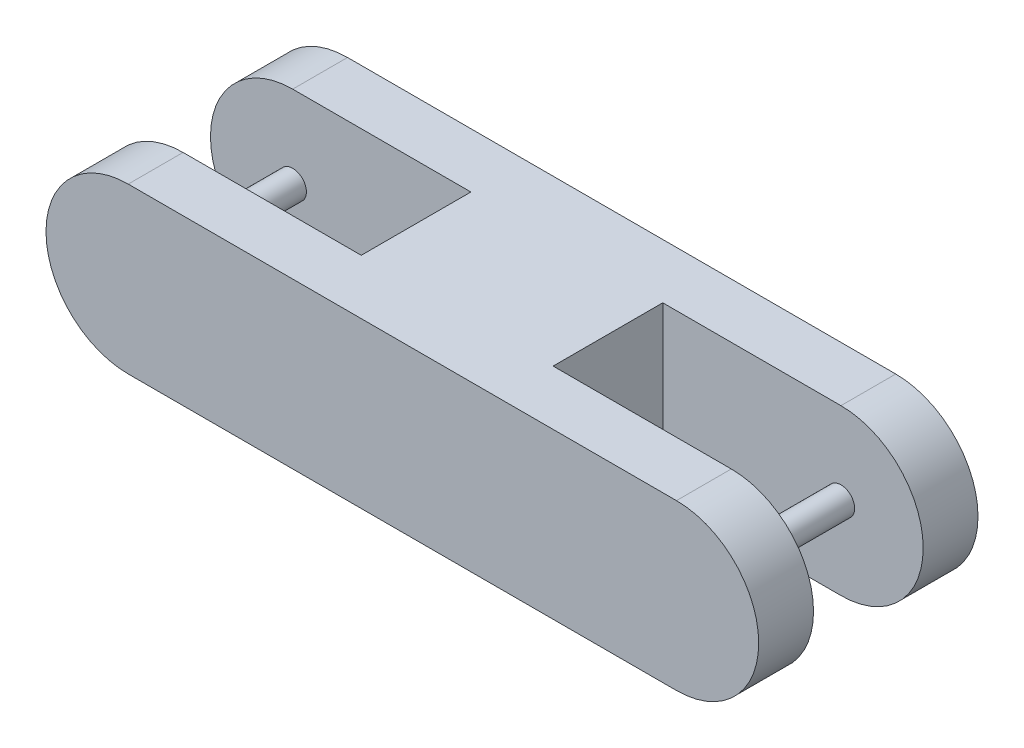
ISO-10303-21;
HEADER;
FILE_DESCRIPTION(('STEP AP214'),'2;1');
FILE_NAME('part.step','',(''),(''),'','','');
FILE_SCHEMA(('AUTOMOTIVE_DESIGN { 1 0 10303 214 1 1 1 1 }'));
ENDSEC;
DATA;
#1=APPLICATION_CONTEXT('core data for automotive mechanical design processes');
#2=APPLICATION_PROTOCOL_DEFINITION('international standard','automotive_design',2000,#1);
#3=PRODUCT_CONTEXT('',#1,'mechanical');
#4=PRODUCT('Part','Part','',(#3));
#5=PRODUCT_RELATED_PRODUCT_CATEGORY('part','',(#4));
#6=PRODUCT_DEFINITION_FORMATION('','',#4);
#7=PRODUCT_DEFINITION_CONTEXT('part definition',#1,'design');
#8=PRODUCT_DEFINITION('design','',#6,#7);
#9=PRODUCT_DEFINITION_SHAPE('','',#8);
#10=(LENGTH_UNIT() NAMED_UNIT(*) SI_UNIT(.MILLI.,.METRE.));
#11=(NAMED_UNIT(*) PLANE_ANGLE_UNIT() SI_UNIT($,.RADIAN.));
#12=(NAMED_UNIT(*) SI_UNIT($,.STERADIAN.) SOLID_ANGLE_UNIT());
#13=UNCERTAINTY_MEASURE_WITH_UNIT(LENGTH_MEASURE(1.E-05),#10,'distance_accuracy_value','');
#14=(GEOMETRIC_REPRESENTATION_CONTEXT(3) GLOBAL_UNCERTAINTY_ASSIGNED_CONTEXT((#13)) GLOBAL_UNIT_ASSIGNED_CONTEXT((#10,
#11,#12)) REPRESENTATION_CONTEXT('',''));
#15=CARTESIAN_POINT('',(0.,0.,0.));
#16=DIRECTION('',(0.,0.,1.));
#17=DIRECTION('',(1.,0.,0.));
#18=AXIS2_PLACEMENT_3D('',#15,#16,#17);
#19=CARTESIAN_POINT('',(254.,0.,101.6));
#20=DIRECTION('',(0.,0.,-1.));
#21=DIRECTION('',(-1.,0.,0.));
#22=AXIS2_PLACEMENT_3D('',#19,#20,#21);
#23=CYLINDRICAL_SURFACE('',#22,38.1000000000001);
#24=CARTESIAN_POINT('',(254.,0.,76.2));
#25=DIRECTION('',(0.,0.,-1.));
#26=DIRECTION('',(-1.,0.,0.));
#27=AXIS2_PLACEMENT_3D('',#24,#25,#26);
#28=CIRCLE('',#27,38.1000000000001);
#29=CARTESIAN_POINT('',(254.,38.1,76.2));
#30=VERTEX_POINT('',#29);
#31=CARTESIAN_POINT('',(254.,-38.1,76.2));
#32=VERTEX_POINT('',#31);
#33=EDGE_CURVE('E168',#30,#32,#28,.T.);
#34=ORIENTED_EDGE('',*,*,#33,.F.);
#35=DIRECTION('',(0.,0.,-1.));
#36=VECTOR('',#35,1.);
#37=CARTESIAN_POINT('',(254.,38.1000000000001,101.6));
#38=LINE('',#37,#36);
#39=CARTESIAN_POINT('',(254.,38.1000000000001,101.6));
#40=VERTEX_POINT('',#39);
#41=EDGE_CURVE('E243',#40,#30,#38,.T.);
#42=ORIENTED_EDGE('',*,*,#41,.F.);
#43=CARTESIAN_POINT('',(254.,0.,101.6));
#44=DIRECTION('',(0.,0.,1.));
#45=DIRECTION('',(1.,0.,0.));
#46=AXIS2_PLACEMENT_3D('',#43,#44,#45);
#47=CIRCLE('',#46,38.1000000000001);
#48=CARTESIAN_POINT('',(254.,-38.1000000000001,101.6));
#49=VERTEX_POINT('',#48);
#50=EDGE_CURVE('E218',#49,#40,#47,.T.);
#51=ORIENTED_EDGE('',*,*,#50,.F.);
#52=DIRECTION('',(0.,0.,-1.));
#53=VECTOR('',#52,1.);
#54=CARTESIAN_POINT('',(254.,-38.1000000000001,101.6));
#55=LINE('',#54,#53);
#56=EDGE_CURVE('E247',#49,#32,#55,.T.);
#57=ORIENTED_EDGE('',*,*,#56,.T.);
#58=EDGE_LOOP('',(#34,#42,#51,#57));
#59=FACE_BOUND('',#58,.T.);
#60=ADVANCED_FACE('F39',(#59),#23,.T.);
#61=CARTESIAN_POINT('',(0.,0.,101.6));
#62=DIRECTION('',(0.,0.,-1.));
#63=DIRECTION('',(-1.,0.,0.));
#64=AXIS2_PLACEMENT_3D('',#61,#62,#63);
#65=CYLINDRICAL_SURFACE('',#64,38.1);
#66=CARTESIAN_POINT('',(0.,0.,76.2));
#67=DIRECTION('',(0.,0.,-1.));
#68=DIRECTION('',(-1.,0.,0.));
#69=AXIS2_PLACEMENT_3D('',#66,#67,#68);
#70=CIRCLE('',#69,38.1);
#71=CARTESIAN_POINT('',(0.,-38.1,76.2));
#72=VERTEX_POINT('',#71);
#73=CARTESIAN_POINT('',(0.,38.1,76.2));
#74=VERTEX_POINT('',#73);
#75=EDGE_CURVE('E63',#72,#74,#70,.T.);
#76=ORIENTED_EDGE('',*,*,#75,.F.);
#77=DIRECTION('',(0.,0.,-1.));
#78=VECTOR('',#77,1.);
#79=CARTESIAN_POINT('',(0.,-38.1,101.6));
#80=LINE('',#79,#78);
#81=CARTESIAN_POINT('',(0.,-38.1,101.6));
#82=VERTEX_POINT('',#81);
#83=EDGE_CURVE('E252',#82,#72,#80,.T.);
#84=ORIENTED_EDGE('',*,*,#83,.F.);
#85=CARTESIAN_POINT('',(0.,0.,101.6));
#86=DIRECTION('',(0.,0.,1.));
#87=DIRECTION('',(1.,0.,0.));
#88=AXIS2_PLACEMENT_3D('',#85,#86,#87);
#89=CIRCLE('',#88,38.1);
#90=CARTESIAN_POINT('',(0.,38.1,101.6));
#91=VERTEX_POINT('',#90);
#92=EDGE_CURVE('E210',#91,#82,#89,.T.);
#93=ORIENTED_EDGE('',*,*,#92,.F.);
#94=DIRECTION('',(0.,0.,-1.));
#95=VECTOR('',#94,1.);
#96=CARTESIAN_POINT('',(0.,38.1,101.6));
#97=LINE('',#96,#95);
#98=EDGE_CURVE('E238',#91,#74,#97,.T.);
#99=ORIENTED_EDGE('',*,*,#98,.T.);
#100=EDGE_LOOP('',(#76,#84,#93,#99));
#101=FACE_BOUND('',#100,.T.);
#102=ADVANCED_FACE('F277',(#101),#65,.T.);
#103=CARTESIAN_POINT('',(0.,-38.1,25.4));
#104=VERTEX_POINT('',#103);
#105=CARTESIAN_POINT('',(0.,-38.1,0.));
#106=VERTEX_POINT('',#105);
#107=EDGE_CURVE('E251',#104,#106,#80,.T.);
#108=ORIENTED_EDGE('',*,*,#107,.F.);
#109=CARTESIAN_POINT('',(0.,0.,25.4));
#110=DIRECTION('',(0.,0.,-1.));
#111=DIRECTION('',(-1.,0.,0.));
#112=AXIS2_PLACEMENT_3D('',#109,#110,#111);
#113=CIRCLE('',#112,38.1);
#114=CARTESIAN_POINT('',(0.,38.1,25.4));
#115=VERTEX_POINT('',#114);
#116=EDGE_CURVE('E205',#104,#115,#113,.T.);
#117=ORIENTED_EDGE('',*,*,#116,.T.);
#118=CARTESIAN_POINT('',(0.,38.1,0.));
#119=VERTEX_POINT('',#118);
#120=EDGE_CURVE('E224',#115,#119,#97,.T.);
#121=ORIENTED_EDGE('',*,*,#120,.T.);
#122=CARTESIAN_POINT('',(0.,0.,0.));
#123=DIRECTION('',(0.,0.,1.));
#124=DIRECTION('',(1.,0.,0.));
#125=AXIS2_PLACEMENT_3D('',#122,#123,#124);
#126=CIRCLE('',#125,38.1);
#127=EDGE_CURVE('E209',#119,#106,#126,.T.);
#128=ORIENTED_EDGE('',*,*,#127,.T.);
#129=EDGE_LOOP('',(#108,#117,#121,#128));
#130=FACE_BOUND('',#129,.T.);
#131=ADVANCED_FACE('F41',(#130),#65,.T.);
#132=CARTESIAN_POINT('',(0.,-38.1,101.6));
#133=DIRECTION('',(0.,1.,0.));
#134=DIRECTION('',(-1.,0.,0.));
#135=AXIS2_PLACEMENT_3D('',#132,#133,#134);
#136=PLANE('',#135);
#137=CARTESIAN_POINT('',(254.,-38.1,25.4));
#138=VERTEX_POINT('',#137);
#139=CARTESIAN_POINT('',(254.,-38.1000000000001,0.));
#140=VERTEX_POINT('',#139);
#141=EDGE_CURVE('E152',#138,#140,#55,.T.);
#142=ORIENTED_EDGE('',*,*,#141,.F.);
#143=DIRECTION('',(-1.,0.,0.));
#144=VECTOR('',#143,1.);
#145=CARTESIAN_POINT('',(336.55,-38.1,25.4));
#146=LINE('',#145,#144);
#147=CARTESIAN_POINT('',(171.45,-38.1,25.4));
#148=VERTEX_POINT('',#147);
#149=EDGE_CURVE('E143',#138,#148,#146,.T.);
#150=ORIENTED_EDGE('',*,*,#149,.T.);
#151=DIRECTION('',(0.,0.,1.));
#152=VECTOR('',#151,1.);
#153=CARTESIAN_POINT('',(171.45,-38.1,25.4));
#154=LINE('',#153,#152);
#155=CARTESIAN_POINT('',(171.45,-38.1,76.2));
#156=VERTEX_POINT('',#155);
#157=EDGE_CURVE('E129',#148,#156,#154,.T.);
#158=ORIENTED_EDGE('',*,*,#157,.T.);
#159=DIRECTION('',(-1.,0.,0.));
#160=VECTOR('',#159,1.);
#161=CARTESIAN_POINT('',(336.55,-38.1,76.2));
#162=LINE('',#161,#160);
#163=EDGE_CURVE('E161',#32,#156,#162,.T.);
#164=ORIENTED_EDGE('',*,*,#163,.F.);
#165=ORIENTED_EDGE('',*,*,#56,.F.);
#166=DIRECTION('',(1.,0.,0.));
#167=VECTOR('',#166,1.);
#168=CARTESIAN_POINT('',(0.,-38.1,101.6));
#169=LINE('',#168,#167);
#170=EDGE_CURVE('E214',#82,#49,#169,.T.);
#171=ORIENTED_EDGE('',*,*,#170,.F.);
#172=ORIENTED_EDGE('',*,*,#83,.T.);
#173=DIRECTION('',(1.,0.,0.));
#174=VECTOR('',#173,1.);
#175=CARTESIAN_POINT('',(-82.55,-38.1,76.2));
#176=LINE('',#175,#174);
#177=CARTESIAN_POINT('',(82.55,-38.1,76.2));
#178=VERTEX_POINT('',#177);
#179=EDGE_CURVE('E181',#72,#178,#176,.T.);
#180=ORIENTED_EDGE('',*,*,#179,.T.);
#181=DIRECTION('',(0.,0.,1.));
#182=VECTOR('',#181,1.);
#183=CARTESIAN_POINT('',(82.55,-38.1,25.4));
#184=LINE('',#183,#182);
#185=CARTESIAN_POINT('',(82.55,-38.1,25.4));
#186=VERTEX_POINT('',#185);
#187=EDGE_CURVE('E197',#186,#178,#184,.T.);
#188=ORIENTED_EDGE('',*,*,#187,.F.);
#189=DIRECTION('',(1.,0.,0.));
#190=VECTOR('',#189,1.);
#191=CARTESIAN_POINT('',(-82.55,-38.1,25.4));
#192=LINE('',#191,#190);
#193=EDGE_CURVE('E184',#104,#186,#192,.T.);
#194=ORIENTED_EDGE('',*,*,#193,.F.);
#195=ORIENTED_EDGE('',*,*,#107,.T.);
#196=DIRECTION('',(1.,0.,0.));
#197=VECTOR('',#196,1.);
#198=CARTESIAN_POINT('',(0.,-38.1,0.));
#199=LINE('',#198,#197);
#200=EDGE_CURVE('E228',#106,#140,#199,.T.);
#201=ORIENTED_EDGE('',*,*,#200,.T.);
#202=EDGE_LOOP('',(#142,#150,#158,#164,#165,#171,#172,#180,#188,#194,#195,#201));
#203=FACE_BOUND('',#202,.T.);
#204=ADVANCED_FACE('F150',(#203),#136,.F.);
#205=CARTESIAN_POINT('',(254.,38.1,25.4));
#206=VERTEX_POINT('',#205);
#207=CARTESIAN_POINT('',(254.,38.1000000000001,0.));
#208=VERTEX_POINT('',#207);
#209=EDGE_CURVE('E242',#206,#208,#38,.T.);
#210=ORIENTED_EDGE('',*,*,#209,.F.);
#211=CARTESIAN_POINT('',(254.,0.,25.4));
#212=DIRECTION('',(0.,0.,-1.));
#213=DIRECTION('',(-1.,0.,0.));
#214=AXIS2_PLACEMENT_3D('',#211,#212,#213);
#215=CIRCLE('',#214,38.1000000000001);
#216=EDGE_CURVE('E172',#206,#138,#215,.T.);
#217=ORIENTED_EDGE('',*,*,#216,.T.);
#218=ORIENTED_EDGE('',*,*,#141,.T.);
#219=CARTESIAN_POINT('',(254.,0.,0.));
#220=DIRECTION('',(0.,0.,1.));
#221=DIRECTION('',(1.,0.,0.));
#222=AXIS2_PLACEMENT_3D('',#219,#220,#221);
#223=CIRCLE('',#222,38.1000000000001);
#224=EDGE_CURVE('E231',#140,#208,#223,.T.);
#225=ORIENTED_EDGE('',*,*,#224,.T.);
#226=EDGE_LOOP('',(#210,#217,#218,#225));
#227=FACE_BOUND('',#226,.T.);
#228=ADVANCED_FACE('F295',(#227),#23,.T.);
#229=CARTESIAN_POINT('',(0.,38.1,101.6));
#230=DIRECTION('',(0.,-1.,0.));
#231=DIRECTION('',(1.,0.,0.));
#232=AXIS2_PLACEMENT_3D('',#229,#230,#231);
#233=PLANE('',#232);
#234=DIRECTION('',(0.,0.,1.));
#235=VECTOR('',#234,1.);
#236=CARTESIAN_POINT('',(171.45,38.1,25.4));
#237=LINE('',#236,#235);
#238=CARTESIAN_POINT('',(171.45,38.1,25.4));
#239=VERTEX_POINT('',#238);
#240=CARTESIAN_POINT('',(171.45,38.1000000000001,76.2));
#241=VERTEX_POINT('',#240);
#242=EDGE_CURVE('E138',#239,#241,#237,.T.);
#243=ORIENTED_EDGE('',*,*,#242,.F.);
#244=DIRECTION('',(1.,0.,0.));
#245=VECTOR('',#244,1.);
#246=CARTESIAN_POINT('',(336.55,38.1,25.4));
#247=LINE('',#246,#245);
#248=EDGE_CURVE('E139',#239,#206,#247,.T.);
#249=ORIENTED_EDGE('',*,*,#248,.T.);
#250=ORIENTED_EDGE('',*,*,#209,.T.);
#251=DIRECTION('',(-1.,0.,0.));
#252=VECTOR('',#251,1.);
#253=CARTESIAN_POINT('',(0.,38.1,0.));
#254=LINE('',#253,#252);
#255=EDGE_CURVE('E215',#208,#119,#254,.T.);
#256=ORIENTED_EDGE('',*,*,#255,.T.);
#257=ORIENTED_EDGE('',*,*,#120,.F.);
#258=DIRECTION('',(-1.,0.,0.));
#259=VECTOR('',#258,1.);
#260=CARTESIAN_POINT('',(-82.55,38.1,25.4));
#261=LINE('',#260,#259);
#262=CARTESIAN_POINT('',(82.55,38.1,25.4));
#263=VERTEX_POINT('',#262);
#264=EDGE_CURVE('E180',#263,#115,#261,.T.);
#265=ORIENTED_EDGE('',*,*,#264,.F.);
#266=DIRECTION('',(0.,0.,1.));
#267=VECTOR('',#266,1.);
#268=CARTESIAN_POINT('',(82.55,38.1,25.4));
#269=LINE('',#268,#267);
#270=CARTESIAN_POINT('',(82.55,38.1,76.2));
#271=VERTEX_POINT('',#270);
#272=EDGE_CURVE('E187',#263,#271,#269,.T.);
#273=ORIENTED_EDGE('',*,*,#272,.T.);
#274=DIRECTION('',(-1.,0.,0.));
#275=VECTOR('',#274,1.);
#276=CARTESIAN_POINT('',(-82.55,38.1,76.2));
#277=LINE('',#276,#275);
#278=EDGE_CURVE('E191',#271,#74,#277,.T.);
#279=ORIENTED_EDGE('',*,*,#278,.T.);
#280=ORIENTED_EDGE('',*,*,#98,.F.);
#281=DIRECTION('',(-1.,0.,0.));
#282=VECTOR('',#281,1.);
#283=CARTESIAN_POINT('',(0.,38.1,101.6));
#284=LINE('',#283,#282);
#285=EDGE_CURVE('E221',#40,#91,#284,.T.);
#286=ORIENTED_EDGE('',*,*,#285,.F.);
#287=ORIENTED_EDGE('',*,*,#41,.T.);
#288=DIRECTION('',(1.,0.,0.));
#289=VECTOR('',#288,1.);
#290=CARTESIAN_POINT('',(336.55,38.1,76.2));
#291=LINE('',#290,#289);
#292=EDGE_CURVE('E147',#241,#30,#291,.T.);
#293=ORIENTED_EDGE('',*,*,#292,.F.);
#294=EDGE_LOOP('',(#243,#249,#250,#256,#257,#265,#273,#279,#280,#286,#287,#293));
#295=FACE_BOUND('',#294,.T.);
#296=ADVANCED_FACE('F282',(#295),#233,.F.);
#297=CARTESIAN_POINT('',(0.,0.,101.6));
#298=DIRECTION('',(0.,0.,1.));
#299=DIRECTION('',(1.,0.,0.));
#300=AXIS2_PLACEMENT_3D('',#297,#298,#299);
#301=PLANE('',#300);
#302=ORIENTED_EDGE('',*,*,#92,.T.);
#303=ORIENTED_EDGE('',*,*,#170,.T.);
#304=ORIENTED_EDGE('',*,*,#50,.T.);
#305=ORIENTED_EDGE('',*,*,#285,.T.);
#306=EDGE_LOOP('',(#302,#303,#304,#305));
#307=FACE_BOUND('',#306,.T.);
#308=ADVANCED_FACE('F298',(#307),#301,.T.);
#309=CARTESIAN_POINT('',(0.,0.,0.));
#310=DIRECTION('',(0.,0.,1.));
#311=DIRECTION('',(1.,0.,0.));
#312=AXIS2_PLACEMENT_3D('',#309,#310,#311);
#313=PLANE('',#312);
#314=ORIENTED_EDGE('',*,*,#127,.F.);
#315=ORIENTED_EDGE('',*,*,#255,.F.);
#316=ORIENTED_EDGE('',*,*,#224,.F.);
#317=ORIENTED_EDGE('',*,*,#200,.F.);
#318=EDGE_LOOP('',(#314,#315,#316,#317));
#319=FACE_BOUND('',#318,.T.);
#320=ADVANCED_FACE('F265',(#319),#313,.F.);
#321=CARTESIAN_POINT('',(0.,0.,25.4));
#322=DIRECTION('',(0.,0.,-1.));
#323=DIRECTION('',(-1.,0.,0.));
#324=AXIS2_PLACEMENT_3D('',#321,#322,#323);
#325=PLANE('',#324);
#326=CARTESIAN_POINT('',(0.,0.,25.4));
#327=DIRECTION('',(0.,0.,-1.));
#328=DIRECTION('',(-1.,0.,0.));
#329=AXIS2_PLACEMENT_3D('',#326,#327,#328);
#330=CIRCLE('',#329,6.35);
#331=CARTESIAN_POINT('',(-6.35,0.,25.4));
#332=VERTEX_POINT('',#331);
#333=EDGE_CURVE('E48',#332,#332,#330,.F.);
#334=ORIENTED_EDGE('',*,*,#333,.F.);
#335=EDGE_LOOP('',(#334));
#336=FACE_BOUND('',#335,.T.);
#337=ORIENTED_EDGE('',*,*,#193,.T.);
#338=DIRECTION('',(0.,1.,0.));
#339=VECTOR('',#338,1.);
#340=CARTESIAN_POINT('',(82.55,-38.1,25.4));
#341=LINE('',#340,#339);
#342=EDGE_CURVE('E176',#186,#263,#341,.T.);
#343=ORIENTED_EDGE('',*,*,#342,.T.);
#344=ORIENTED_EDGE('',*,*,#264,.T.);
#345=ORIENTED_EDGE('',*,*,#116,.F.);
#346=EDGE_LOOP('',(#337,#343,#344,#345));
#347=FACE_BOUND('',#346,.T.);
#348=ADVANCED_FACE('F261',(#336,#347),#325,.F.);
#349=CARTESIAN_POINT('',(0.,0.,76.2));
#350=DIRECTION('',(0.,0.,-1.));
#351=DIRECTION('',(-1.,0.,0.));
#352=AXIS2_PLACEMENT_3D('',#349,#350,#351);
#353=PLANE('',#352);
#354=CARTESIAN_POINT('',(0.,0.,76.2));
#355=DIRECTION('',(0.,0.,-1.));
#356=DIRECTION('',(-1.,0.,0.));
#357=AXIS2_PLACEMENT_3D('',#354,#355,#356);
#358=CIRCLE('',#357,6.35);
#359=CARTESIAN_POINT('',(-6.35,0.,76.2));
#360=VERTEX_POINT('',#359);
#361=EDGE_CURVE('E162',#360,#360,#358,.T.);
#362=ORIENTED_EDGE('',*,*,#361,.F.);
#363=EDGE_LOOP('',(#362));
#364=FACE_BOUND('',#363,.T.);
#365=ORIENTED_EDGE('',*,*,#75,.T.);
#366=ORIENTED_EDGE('',*,*,#278,.F.);
#367=DIRECTION('',(0.,1.,0.));
#368=VECTOR('',#367,1.);
#369=CARTESIAN_POINT('',(82.55,-38.1,76.2));
#370=LINE('',#369,#368);
#371=EDGE_CURVE('E175',#178,#271,#370,.T.);
#372=ORIENTED_EDGE('',*,*,#371,.F.);
#373=ORIENTED_EDGE('',*,*,#179,.F.);
#374=EDGE_LOOP('',(#365,#366,#372,#373));
#375=FACE_BOUND('',#374,.T.);
#376=ADVANCED_FACE('F264',(#364,#375),#353,.T.);
#377=CARTESIAN_POINT('',(82.55,-38.1,25.4));
#378=DIRECTION('',(1.,0.,0.));
#379=DIRECTION('',(0.,0.,-1.));
#380=AXIS2_PLACEMENT_3D('',#377,#378,#379);
#381=PLANE('',#380);
#382=ORIENTED_EDGE('',*,*,#371,.T.);
#383=ORIENTED_EDGE('',*,*,#272,.F.);
#384=ORIENTED_EDGE('',*,*,#342,.F.);
#385=ORIENTED_EDGE('',*,*,#187,.T.);
#386=EDGE_LOOP('',(#382,#383,#384,#385));
#387=FACE_BOUND('',#386,.T.);
#388=ADVANCED_FACE('F273',(#387),#381,.F.);
#389=CARTESIAN_POINT('',(254.,0.,25.4));
#390=DIRECTION('',(0.,0.,-1.));
#391=DIRECTION('',(1.,0.,0.));
#392=AXIS2_PLACEMENT_3D('',#389,#390,#391);
#393=PLANE('',#392);
#394=CARTESIAN_POINT('',(254.,0.,25.4));
#395=DIRECTION('',(0.,0.,-1.));
#396=DIRECTION('',(-1.,0.,0.));
#397=AXIS2_PLACEMENT_3D('',#394,#395,#396);
#398=CIRCLE('',#397,6.35);
#399=CARTESIAN_POINT('',(247.65,0.,25.4));
#400=VERTEX_POINT('',#399);
#401=EDGE_CURVE('E434',#400,#400,#398,.T.);
#402=ORIENTED_EDGE('',*,*,#401,.T.);
#403=EDGE_LOOP('',(#402));
#404=FACE_BOUND('',#403,.T.);
#405=ORIENTED_EDGE('',*,*,#248,.F.);
#406=DIRECTION('',(0.,1.,0.));
#407=VECTOR('',#406,1.);
#408=CARTESIAN_POINT('',(171.45,-38.1,25.4));
#409=LINE('',#408,#407);
#410=EDGE_CURVE('E132',#148,#239,#409,.T.);
#411=ORIENTED_EDGE('',*,*,#410,.F.);
#412=ORIENTED_EDGE('',*,*,#149,.F.);
#413=ORIENTED_EDGE('',*,*,#216,.F.);
#414=EDGE_LOOP('',(#405,#411,#412,#413));
#415=FACE_BOUND('',#414,.T.);
#416=ADVANCED_FACE('F142',(#404,#415),#393,.F.);
#417=CARTESIAN_POINT('',(254.,0.,76.2));
#418=DIRECTION('',(0.,0.,-1.));
#419=DIRECTION('',(1.,0.,0.));
#420=AXIS2_PLACEMENT_3D('',#417,#418,#419);
#421=PLANE('',#420);
#422=CARTESIAN_POINT('',(254.,0.,76.2));
#423=DIRECTION('',(0.,0.,-1.));
#424=DIRECTION('',(-1.,0.,0.));
#425=AXIS2_PLACEMENT_3D('',#422,#423,#424);
#426=CIRCLE('',#425,6.35);
#427=CARTESIAN_POINT('',(247.65,0.,76.2));
#428=VERTEX_POINT('',#427);
#429=EDGE_CURVE('E11',#428,#428,#426,.T.);
#430=ORIENTED_EDGE('',*,*,#429,.F.);
#431=EDGE_LOOP('',(#430));
#432=FACE_BOUND('',#431,.T.);
#433=ORIENTED_EDGE('',*,*,#33,.T.);
#434=ORIENTED_EDGE('',*,*,#163,.T.);
#435=DIRECTION('',(0.,1.,0.));
#436=VECTOR('',#435,1.);
#437=CARTESIAN_POINT('',(171.45,-38.1,76.2));
#438=LINE('',#437,#436);
#439=EDGE_CURVE('E55',#156,#241,#438,.T.);
#440=ORIENTED_EDGE('',*,*,#439,.T.);
#441=ORIENTED_EDGE('',*,*,#292,.T.);
#442=EDGE_LOOP('',(#433,#434,#440,#441));
#443=FACE_BOUND('',#442,.T.);
#444=ADVANCED_FACE('F356',(#432,#443),#421,.T.);
#445=CARTESIAN_POINT('',(171.45,-38.1,25.4));
#446=DIRECTION('',(1.,0.,0.));
#447=DIRECTION('',(0.,0.,-1.));
#448=AXIS2_PLACEMENT_3D('',#445,#446,#447);
#449=PLANE('',#448);
#450=ORIENTED_EDGE('',*,*,#439,.F.);
#451=ORIENTED_EDGE('',*,*,#157,.F.);
#452=ORIENTED_EDGE('',*,*,#410,.T.);
#453=ORIENTED_EDGE('',*,*,#242,.T.);
#454=EDGE_LOOP('',(#450,#451,#452,#453));
#455=FACE_BOUND('',#454,.T.);
#456=ADVANCED_FACE('F131',(#455),#449,.T.);
#457=CARTESIAN_POINT('',(0.,0.,101.602));
#458=DIRECTION('',(0.,0.,-1.));
#459=DIRECTION('',(-1.,0.,0.));
#460=AXIS2_PLACEMENT_3D('',#457,#458,#459);
#461=CYLINDRICAL_SURFACE('',#460,6.35);
#462=ORIENTED_EDGE('',*,*,#361,.T.);
#463=EDGE_LOOP('',(#462));
#464=FACE_BOUND('',#463,.T.);
#465=ORIENTED_EDGE('',*,*,#333,.T.);
#466=EDGE_LOOP('',(#465));
#467=FACE_BOUND('',#466,.T.);
#468=ADVANCED_FACE('F259',(#464,#467),#461,.T.);
#469=CARTESIAN_POINT('',(254.,0.,101.602));
#470=DIRECTION('',(0.,0.,-1.));
#471=DIRECTION('',(-1.,0.,0.));
#472=AXIS2_PLACEMENT_3D('',#469,#470,#471);
#473=CYLINDRICAL_SURFACE('',#472,6.35);
#474=ORIENTED_EDGE('',*,*,#429,.T.);
#475=EDGE_LOOP('',(#474));
#476=FACE_BOUND('',#475,.T.);
#477=ORIENTED_EDGE('',*,*,#401,.F.);
#478=EDGE_LOOP('',(#477));
#479=FACE_BOUND('',#478,.T.);
#480=ADVANCED_FACE('F383',(#476,#479),#473,.T.);
#481=CLOSED_SHELL('',(#60,#102,#131,#204,#228,#296,#308,#320,#348,#376,#388,#416,#444,#456,#468,#480));
#482=MANIFOLD_SOLID_BREP('B2',#481);
#483=ADVANCED_BREP_SHAPE_REPRESENTATION('',(#18,#482),#14);
#484=SHAPE_DEFINITION_REPRESENTATION(#9,#483);
ENDSEC;
END-ISO-10303-21;
